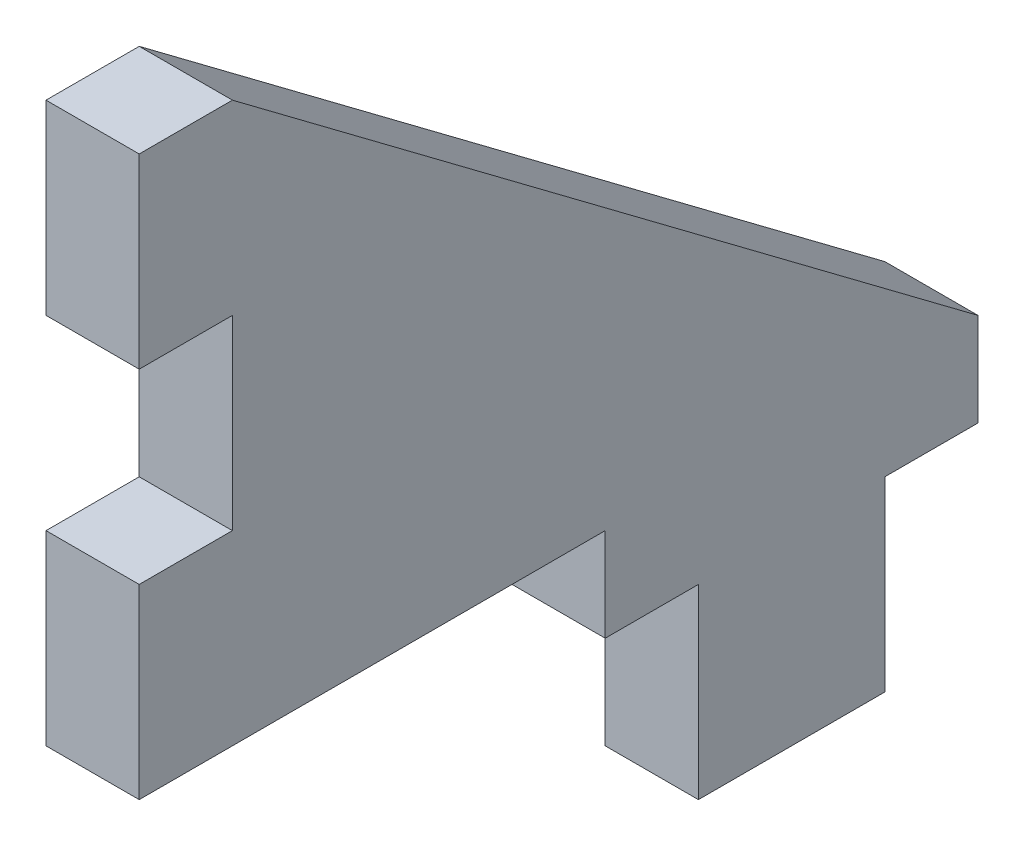
ISO-10303-21;
HEADER;
FILE_DESCRIPTION(('STEP AP214'),'2;1');
FILE_NAME('part.step','',(''),(''),'','','');
FILE_SCHEMA(('AUTOMOTIVE_DESIGN { 1 0 10303 214 1 1 1 1 }'));
ENDSEC;
DATA;
#1=APPLICATION_CONTEXT('core data for automotive mechanical design processes');
#2=APPLICATION_PROTOCOL_DEFINITION('international standard','automotive_design',2000,#1);
#3=PRODUCT_CONTEXT('',#1,'mechanical');
#4=PRODUCT('Part','Part','',(#3));
#5=PRODUCT_RELATED_PRODUCT_CATEGORY('part','',(#4));
#6=PRODUCT_DEFINITION_FORMATION('','',#4);
#7=PRODUCT_DEFINITION_CONTEXT('part definition',#1,'design');
#8=PRODUCT_DEFINITION('design','',#6,#7);
#9=PRODUCT_DEFINITION_SHAPE('','',#8);
#10=(LENGTH_UNIT() NAMED_UNIT(*) SI_UNIT(.MILLI.,.METRE.));
#11=(NAMED_UNIT(*) PLANE_ANGLE_UNIT() SI_UNIT($,.RADIAN.));
#12=(NAMED_UNIT(*) SI_UNIT($,.STERADIAN.) SOLID_ANGLE_UNIT());
#13=UNCERTAINTY_MEASURE_WITH_UNIT(LENGTH_MEASURE(1.E-05),#10,'distance_accuracy_value','');
#14=(GEOMETRIC_REPRESENTATION_CONTEXT(3) GLOBAL_UNCERTAINTY_ASSIGNED_CONTEXT((#13)) GLOBAL_UNIT_ASSIGNED_CONTEXT((#10,
#11,#12)) REPRESENTATION_CONTEXT('',''));
#15=CARTESIAN_POINT('',(0.,0.,0.));
#16=DIRECTION('',(0.,0.,1.));
#17=DIRECTION('',(1.,0.,0.));
#18=AXIS2_PLACEMENT_3D('',#15,#16,#17);
#19=CARTESIAN_POINT('',(2.5,11.25,11.25));
#20=DIRECTION('',(0.,1.,0.));
#21=DIRECTION('',(0.,0.,1.));
#22=AXIS2_PLACEMENT_3D('',#19,#20,#21);
#23=PLANE('',#22);
#24=DIRECTION('',(0.,0.,-1.));
#25=VECTOR('',#24,1.);
#26=CARTESIAN_POINT('',(0.,11.25,11.25));
#27=LINE('',#26,#25);
#28=CARTESIAN_POINT('',(0.,11.25,11.25));
#29=VERTEX_POINT('',#28);
#30=CARTESIAN_POINT('',(0.,11.25,8.75));
#31=VERTEX_POINT('',#30);
#32=EDGE_CURVE('E184',#29,#31,#27,.T.);
#33=ORIENTED_EDGE('',*,*,#32,.F.);
#34=DIRECTION('',(-1.,0.,0.));
#35=VECTOR('',#34,1.);
#36=CARTESIAN_POINT('',(2.5,11.25,11.25));
#37=LINE('',#36,#35);
#38=CARTESIAN_POINT('',(2.5,11.25,11.25));
#39=VERTEX_POINT('',#38);
#40=EDGE_CURVE('E11',#39,#29,#37,.T.);
#41=ORIENTED_EDGE('',*,*,#40,.F.);
#42=DIRECTION('',(0.,0.,-1.));
#43=VECTOR('',#42,1.);
#44=CARTESIAN_POINT('',(2.5,11.25,11.25));
#45=LINE('',#44,#43);
#46=CARTESIAN_POINT('',(2.5,11.25,8.75));
#47=VERTEX_POINT('',#46);
#48=EDGE_CURVE('E238',#39,#47,#45,.T.);
#49=ORIENTED_EDGE('',*,*,#48,.T.);
#50=DIRECTION('',(-1.,0.,0.));
#51=VECTOR('',#50,1.);
#52=CARTESIAN_POINT('',(2.5,11.25,8.75));
#53=LINE('',#52,#51);
#54=EDGE_CURVE('E42',#47,#31,#53,.T.);
#55=ORIENTED_EDGE('',*,*,#54,.T.);
#56=EDGE_LOOP('',(#33,#41,#49,#55));
#57=FACE_BOUND('',#56,.T.);
#58=ADVANCED_FACE('F39',(#57),#23,.T.);
#59=CARTESIAN_POINT('',(2.5,6.25,11.25));
#60=DIRECTION('',(0.,0.,1.));
#61=DIRECTION('',(0.,-1.,0.));
#62=AXIS2_PLACEMENT_3D('',#59,#60,#61);
#63=PLANE('',#62);
#64=DIRECTION('',(0.,1.,0.));
#65=VECTOR('',#64,1.);
#66=CARTESIAN_POINT('',(0.,6.25,11.25));
#67=LINE('',#66,#65);
#68=CARTESIAN_POINT('',(0.,6.25,11.25));
#69=VERTEX_POINT('',#68);
#70=EDGE_CURVE('E235',#69,#29,#67,.T.);
#71=ORIENTED_EDGE('',*,*,#70,.F.);
#72=DIRECTION('',(-1.,0.,0.));
#73=VECTOR('',#72,1.);
#74=CARTESIAN_POINT('',(2.5,6.25,11.25));
#75=LINE('',#74,#73);
#76=CARTESIAN_POINT('',(2.5,6.25,11.25));
#77=VERTEX_POINT('',#76);
#78=EDGE_CURVE('E49',#77,#69,#75,.T.);
#79=ORIENTED_EDGE('',*,*,#78,.F.);
#80=DIRECTION('',(0.,1.,0.));
#81=VECTOR('',#80,1.);
#82=CARTESIAN_POINT('',(2.5,6.25,11.25));
#83=LINE('',#82,#81);
#84=EDGE_CURVE('E170',#77,#39,#83,.T.);
#85=ORIENTED_EDGE('',*,*,#84,.T.);
#86=ORIENTED_EDGE('',*,*,#40,.T.);
#87=EDGE_LOOP('',(#71,#79,#85,#86));
#88=FACE_BOUND('',#87,.T.);
#89=ADVANCED_FACE('F279',(#88),#63,.T.);
#90=CARTESIAN_POINT('',(2.5,6.25,8.75000000000001));
#91=DIRECTION('',(0.,-1.,0.));
#92=DIRECTION('',(0.,0.,-1.));
#93=AXIS2_PLACEMENT_3D('',#90,#91,#92);
#94=PLANE('',#93);
#95=DIRECTION('',(0.,0.,1.));
#96=VECTOR('',#95,1.);
#97=CARTESIAN_POINT('',(0.,6.25,8.75000000000001));
#98=LINE('',#97,#96);
#99=CARTESIAN_POINT('',(0.,6.25,8.75000000000001));
#100=VERTEX_POINT('',#99);
#101=EDGE_CURVE('E156',#100,#69,#98,.T.);
#102=ORIENTED_EDGE('',*,*,#101,.F.);
#103=DIRECTION('',(-1.,0.,0.));
#104=VECTOR('',#103,1.);
#105=CARTESIAN_POINT('',(2.5,6.25,8.75000000000001));
#106=LINE('',#105,#104);
#107=CARTESIAN_POINT('',(2.5,6.25,8.75000000000001));
#108=VERTEX_POINT('',#107);
#109=EDGE_CURVE('E151',#108,#100,#106,.T.);
#110=ORIENTED_EDGE('',*,*,#109,.F.);
#111=DIRECTION('',(0.,0.,1.));
#112=VECTOR('',#111,1.);
#113=CARTESIAN_POINT('',(2.5,6.25,8.75000000000001));
#114=LINE('',#113,#112);
#115=EDGE_CURVE('E154',#108,#77,#114,.T.);
#116=ORIENTED_EDGE('',*,*,#115,.T.);
#117=ORIENTED_EDGE('',*,*,#78,.T.);
#118=EDGE_LOOP('',(#102,#110,#116,#117));
#119=FACE_BOUND('',#118,.T.);
#120=ADVANCED_FACE('F153',(#119),#94,.T.);
#121=CARTESIAN_POINT('',(2.5,1.25,8.75000000000001));
#122=DIRECTION('',(0.,0.,1.));
#123=DIRECTION('',(1.,0.,0.));
#124=AXIS2_PLACEMENT_3D('',#121,#122,#123);
#125=PLANE('',#124);
#126=DIRECTION('',(0.,1.,0.));
#127=VECTOR('',#126,1.);
#128=CARTESIAN_POINT('',(0.,1.25,8.75000000000001));
#129=LINE('',#128,#127);
#130=CARTESIAN_POINT('',(0.,1.25,8.75000000000001));
#131=VERTEX_POINT('',#130);
#132=EDGE_CURVE('E230',#131,#100,#129,.T.);
#133=ORIENTED_EDGE('',*,*,#132,.F.);
#134=DIRECTION('',(-1.,0.,0.));
#135=VECTOR('',#134,1.);
#136=CARTESIAN_POINT('',(2.5,1.25,8.75000000000001));
#137=LINE('',#136,#135);
#138=CARTESIAN_POINT('',(2.5,1.25,8.75000000000001));
#139=VERTEX_POINT('',#138);
#140=EDGE_CURVE('E162',#139,#131,#137,.T.);
#141=ORIENTED_EDGE('',*,*,#140,.F.);
#142=DIRECTION('',(0.,1.,0.));
#143=VECTOR('',#142,1.);
#144=CARTESIAN_POINT('',(2.5,1.25,8.75000000000001));
#145=LINE('',#144,#143);
#146=EDGE_CURVE('E168',#139,#108,#145,.T.);
#147=ORIENTED_EDGE('',*,*,#146,.T.);
#148=ORIENTED_EDGE('',*,*,#109,.T.);
#149=EDGE_LOOP('',(#133,#141,#147,#148));
#150=FACE_BOUND('',#149,.T.);
#151=ADVANCED_FACE('F173',(#150),#125,.T.);
#152=CARTESIAN_POINT('',(2.5,1.25,11.25));
#153=DIRECTION('',(0.,1.,0.));
#154=DIRECTION('',(0.,0.,1.));
#155=AXIS2_PLACEMENT_3D('',#152,#153,#154);
#156=PLANE('',#155);
#157=DIRECTION('',(0.,0.,-1.));
#158=VECTOR('',#157,1.);
#159=CARTESIAN_POINT('',(0.,1.25,11.25));
#160=LINE('',#159,#158);
#161=CARTESIAN_POINT('',(0.,1.25,11.25));
#162=VERTEX_POINT('',#161);
#163=EDGE_CURVE('E226',#162,#131,#160,.T.);
#164=ORIENTED_EDGE('',*,*,#163,.F.);
#165=DIRECTION('',(-1.,0.,0.));
#166=VECTOR('',#165,1.);
#167=CARTESIAN_POINT('',(2.5,1.25,11.25));
#168=LINE('',#167,#166);
#169=CARTESIAN_POINT('',(2.5,1.25,11.25));
#170=VERTEX_POINT('',#169);
#171=EDGE_CURVE('E244',#170,#162,#168,.T.);
#172=ORIENTED_EDGE('',*,*,#171,.F.);
#173=DIRECTION('',(0.,0.,-1.));
#174=VECTOR('',#173,1.);
#175=CARTESIAN_POINT('',(2.5,1.25,11.25));
#176=LINE('',#175,#174);
#177=EDGE_CURVE('E175',#170,#139,#176,.T.);
#178=ORIENTED_EDGE('',*,*,#177,.T.);
#179=ORIENTED_EDGE('',*,*,#140,.T.);
#180=EDGE_LOOP('',(#164,#172,#178,#179));
#181=FACE_BOUND('',#180,.T.);
#182=ADVANCED_FACE('F292',(#181),#156,.T.);
#183=CARTESIAN_POINT('',(2.5,-3.75,11.25));
#184=DIRECTION('',(0.,0.,1.));
#185=DIRECTION('',(0.,-1.,0.));
#186=AXIS2_PLACEMENT_3D('',#183,#184,#185);
#187=PLANE('',#186);
#188=DIRECTION('',(0.,1.,0.));
#189=VECTOR('',#188,1.);
#190=CARTESIAN_POINT('',(0.,-3.75,11.25));
#191=LINE('',#190,#189);
#192=CARTESIAN_POINT('',(0.,-3.75,11.25));
#193=VERTEX_POINT('',#192);
#194=EDGE_CURVE('E222',#193,#162,#191,.T.);
#195=ORIENTED_EDGE('',*,*,#194,.F.);
#196=DIRECTION('',(-1.,0.,0.));
#197=VECTOR('',#196,1.);
#198=CARTESIAN_POINT('',(2.5,-3.75,11.25));
#199=LINE('',#198,#197);
#200=CARTESIAN_POINT('',(2.5,-3.75,11.25));
#201=VERTEX_POINT('',#200);
#202=EDGE_CURVE('E247',#201,#193,#199,.T.);
#203=ORIENTED_EDGE('',*,*,#202,.F.);
#204=DIRECTION('',(0.,1.,0.));
#205=VECTOR('',#204,1.);
#206=CARTESIAN_POINT('',(2.5,-3.75,11.25));
#207=LINE('',#206,#205);
#208=EDGE_CURVE('E178',#201,#170,#207,.T.);
#209=ORIENTED_EDGE('',*,*,#208,.T.);
#210=ORIENTED_EDGE('',*,*,#171,.T.);
#211=EDGE_LOOP('',(#195,#203,#209,#210));
#212=FACE_BOUND('',#211,.T.);
#213=ADVANCED_FACE('F295',(#212),#187,.T.);
#214=CARTESIAN_POINT('',(2.5,-3.75,11.25));
#215=DIRECTION('',(0.,1.,0.));
#216=DIRECTION('',(0.,0.,1.));
#217=AXIS2_PLACEMENT_3D('',#214,#215,#216);
#218=PLANE('',#217);
#219=DIRECTION('',(0.,0.,-1.));
#220=VECTOR('',#219,1.);
#221=CARTESIAN_POINT('',(0.,-3.75,11.25));
#222=LINE('',#221,#220);
#223=CARTESIAN_POINT('',(0.,-3.75,-1.25));
#224=VERTEX_POINT('',#223);
#225=EDGE_CURVE('E219',#193,#224,#222,.T.);
#226=ORIENTED_EDGE('',*,*,#225,.T.);
#227=DIRECTION('',(-1.,0.,0.));
#228=VECTOR('',#227,1.);
#229=CARTESIAN_POINT('',(2.5,-3.75,-1.25));
#230=LINE('',#229,#228);
#231=CARTESIAN_POINT('',(2.5,-3.75,-1.25));
#232=VERTEX_POINT('',#231);
#233=EDGE_CURVE('E250',#232,#224,#230,.T.);
#234=ORIENTED_EDGE('',*,*,#233,.F.);
#235=DIRECTION('',(0.,0.,-1.));
#236=VECTOR('',#235,1.);
#237=CARTESIAN_POINT('',(2.5,-3.75,11.25));
#238=LINE('',#237,#236);
#239=EDGE_CURVE('E466',#201,#232,#238,.T.);
#240=ORIENTED_EDGE('',*,*,#239,.F.);
#241=ORIENTED_EDGE('',*,*,#202,.T.);
#242=EDGE_LOOP('',(#226,#234,#240,#241));
#243=FACE_BOUND('',#242,.T.);
#244=ADVANCED_FACE('F299',(#243),#218,.F.);
#245=CARTESIAN_POINT('',(2.5,-3.75,-1.25));
#246=DIRECTION('',(0.,0.,-1.));
#247=DIRECTION('',(0.,1.,0.));
#248=AXIS2_PLACEMENT_3D('',#245,#246,#247);
#249=PLANE('',#248);
#250=DIRECTION('',(0.,-1.,0.));
#251=VECTOR('',#250,1.);
#252=CARTESIAN_POINT('',(0.,-3.75,-1.25));
#253=LINE('',#252,#251);
#254=CARTESIAN_POINT('',(0.,-6.25,-1.25));
#255=VERTEX_POINT('',#254);
#256=EDGE_CURVE('E216',#224,#255,#253,.T.);
#257=ORIENTED_EDGE('',*,*,#256,.T.);
#258=DIRECTION('',(-1.,0.,0.));
#259=VECTOR('',#258,1.);
#260=CARTESIAN_POINT('',(2.5,-6.25,-1.25));
#261=LINE('',#260,#259);
#262=CARTESIAN_POINT('',(2.5,-6.25,-1.25));
#263=VERTEX_POINT('',#262);
#264=EDGE_CURVE('E254',#263,#255,#261,.T.);
#265=ORIENTED_EDGE('',*,*,#264,.F.);
#266=DIRECTION('',(0.,-1.,0.));
#267=VECTOR('',#266,1.);
#268=CARTESIAN_POINT('',(2.5,-3.75,-1.25));
#269=LINE('',#268,#267);
#270=EDGE_CURVE('E458',#232,#263,#269,.T.);
#271=ORIENTED_EDGE('',*,*,#270,.F.);
#272=ORIENTED_EDGE('',*,*,#233,.T.);
#273=EDGE_LOOP('',(#257,#265,#271,#272));
#274=FACE_BOUND('',#273,.T.);
#275=ADVANCED_FACE('F303',(#274),#249,.F.);
#276=CARTESIAN_POINT('',(2.5,-6.25,-1.25));
#277=DIRECTION('',(0.,1.,0.));
#278=DIRECTION('',(0.,0.,1.));
#279=AXIS2_PLACEMENT_3D('',#276,#277,#278);
#280=PLANE('',#279);
#281=DIRECTION('',(0.,0.,-1.));
#282=VECTOR('',#281,1.);
#283=CARTESIAN_POINT('',(0.,-6.25,-1.25));
#284=LINE('',#283,#282);
#285=CARTESIAN_POINT('',(0.,-6.25,-3.75));
#286=VERTEX_POINT('',#285);
#287=EDGE_CURVE('E212',#255,#286,#284,.T.);
#288=ORIENTED_EDGE('',*,*,#287,.T.);
#289=DIRECTION('',(-1.,0.,0.));
#290=VECTOR('',#289,1.);
#291=CARTESIAN_POINT('',(2.5,-6.25,-3.75));
#292=LINE('',#291,#290);
#293=CARTESIAN_POINT('',(2.5,-6.25,-3.75));
#294=VERTEX_POINT('',#293);
#295=EDGE_CURVE('E258',#294,#286,#292,.T.);
#296=ORIENTED_EDGE('',*,*,#295,.F.);
#297=DIRECTION('',(0.,0.,-1.));
#298=VECTOR('',#297,1.);
#299=CARTESIAN_POINT('',(2.5,-6.25,-1.25));
#300=LINE('',#299,#298);
#301=EDGE_CURVE('E456',#263,#294,#300,.T.);
#302=ORIENTED_EDGE('',*,*,#301,.F.);
#303=ORIENTED_EDGE('',*,*,#264,.T.);
#304=EDGE_LOOP('',(#288,#296,#302,#303));
#305=FACE_BOUND('',#304,.T.);
#306=ADVANCED_FACE('F307',(#305),#280,.F.);
#307=CARTESIAN_POINT('',(2.5,-11.25,-3.75));
#308=DIRECTION('',(0.,0.,1.));
#309=DIRECTION('',(1.,0.,0.));
#310=AXIS2_PLACEMENT_3D('',#307,#308,#309);
#311=PLANE('',#310);
#312=DIRECTION('',(0.,1.,0.));
#313=VECTOR('',#312,1.);
#314=CARTESIAN_POINT('',(0.,-11.25,-3.75));
#315=LINE('',#314,#313);
#316=CARTESIAN_POINT('',(0.,-11.25,-3.75));
#317=VERTEX_POINT('',#316);
#318=EDGE_CURVE('E208',#317,#286,#315,.T.);
#319=ORIENTED_EDGE('',*,*,#318,.F.);
#320=DIRECTION('',(-1.,0.,0.));
#321=VECTOR('',#320,1.);
#322=CARTESIAN_POINT('',(2.5,-11.25,-3.75));
#323=LINE('',#322,#321);
#324=CARTESIAN_POINT('',(2.5,-11.25,-3.75));
#325=VERTEX_POINT('',#324);
#326=EDGE_CURVE('E261',#325,#317,#323,.T.);
#327=ORIENTED_EDGE('',*,*,#326,.F.);
#328=DIRECTION('',(0.,1.,0.));
#329=VECTOR('',#328,1.);
#330=CARTESIAN_POINT('',(2.5,-11.25,-3.75));
#331=LINE('',#330,#329);
#332=EDGE_CURVE('E453',#325,#294,#331,.T.);
#333=ORIENTED_EDGE('',*,*,#332,.T.);
#334=ORIENTED_EDGE('',*,*,#295,.T.);
#335=EDGE_LOOP('',(#319,#327,#333,#334));
#336=FACE_BOUND('',#335,.T.);
#337=ADVANCED_FACE('F311',(#336),#311,.T.);
#338=CARTESIAN_POINT('',(2.5,-11.25,-8.75));
#339=DIRECTION('',(0.,-1.,0.));
#340=DIRECTION('',(0.,0.,-1.));
#341=AXIS2_PLACEMENT_3D('',#338,#339,#340);
#342=PLANE('',#341);
#343=DIRECTION('',(0.,0.,1.));
#344=VECTOR('',#343,1.);
#345=CARTESIAN_POINT('',(0.,-11.25,-8.75));
#346=LINE('',#345,#344);
#347=CARTESIAN_POINT('',(0.,-11.25,-8.75));
#348=VERTEX_POINT('',#347);
#349=EDGE_CURVE('E204',#348,#317,#346,.T.);
#350=ORIENTED_EDGE('',*,*,#349,.F.);
#351=DIRECTION('',(-1.,0.,0.));
#352=VECTOR('',#351,1.);
#353=CARTESIAN_POINT('',(2.5,-11.25,-8.75));
#354=LINE('',#353,#352);
#355=CARTESIAN_POINT('',(2.5,-11.25,-8.75));
#356=VERTEX_POINT('',#355);
#357=EDGE_CURVE('E264',#356,#348,#354,.T.);
#358=ORIENTED_EDGE('',*,*,#357,.F.);
#359=DIRECTION('',(0.,0.,1.));
#360=VECTOR('',#359,1.);
#361=CARTESIAN_POINT('',(2.5,-11.25,-8.75));
#362=LINE('',#361,#360);
#363=EDGE_CURVE('E477',#356,#325,#362,.T.);
#364=ORIENTED_EDGE('',*,*,#363,.T.);
#365=ORIENTED_EDGE('',*,*,#326,.T.);
#366=EDGE_LOOP('',(#350,#358,#364,#365));
#367=FACE_BOUND('',#366,.T.);
#368=ADVANCED_FACE('F315',(#367),#342,.T.);
#369=CARTESIAN_POINT('',(2.5,-6.25,-8.75));
#370=DIRECTION('',(0.,0.,-1.));
#371=DIRECTION('',(0.,1.,0.));
#372=AXIS2_PLACEMENT_3D('',#369,#370,#371);
#373=PLANE('',#372);
#374=DIRECTION('',(0.,-1.,0.));
#375=VECTOR('',#374,1.);
#376=CARTESIAN_POINT('',(0.,-6.25,-8.75));
#377=LINE('',#376,#375);
#378=CARTESIAN_POINT('',(0.,-6.25,-8.75));
#379=VERTEX_POINT('',#378);
#380=EDGE_CURVE('E200',#379,#348,#377,.T.);
#381=ORIENTED_EDGE('',*,*,#380,.F.);
#382=DIRECTION('',(-1.,0.,0.));
#383=VECTOR('',#382,1.);
#384=CARTESIAN_POINT('',(2.5,-6.25,-8.75));
#385=LINE('',#384,#383);
#386=CARTESIAN_POINT('',(2.5,-6.25,-8.75));
#387=VERTEX_POINT('',#386);
#388=EDGE_CURVE('E267',#387,#379,#385,.T.);
#389=ORIENTED_EDGE('',*,*,#388,.F.);
#390=DIRECTION('',(0.,-1.,0.));
#391=VECTOR('',#390,1.);
#392=CARTESIAN_POINT('',(2.5,-6.25,-8.75));
#393=LINE('',#392,#391);
#394=EDGE_CURVE('E444',#387,#356,#393,.T.);
#395=ORIENTED_EDGE('',*,*,#394,.T.);
#396=ORIENTED_EDGE('',*,*,#357,.T.);
#397=EDGE_LOOP('',(#381,#389,#395,#396));
#398=FACE_BOUND('',#397,.T.);
#399=ADVANCED_FACE('F319',(#398),#373,.T.);
#400=CARTESIAN_POINT('',(2.5,-6.25,-11.25));
#401=DIRECTION('',(0.,-1.,0.));
#402=DIRECTION('',(0.,0.,-1.));
#403=AXIS2_PLACEMENT_3D('',#400,#401,#402);
#404=PLANE('',#403);
#405=DIRECTION('',(0.,0.,1.));
#406=VECTOR('',#405,1.);
#407=CARTESIAN_POINT('',(0.,-6.25,-11.25));
#408=LINE('',#407,#406);
#409=CARTESIAN_POINT('',(0.,-6.25,-11.25));
#410=VERTEX_POINT('',#409);
#411=EDGE_CURVE('E196',#410,#379,#408,.T.);
#412=ORIENTED_EDGE('',*,*,#411,.F.);
#413=DIRECTION('',(-1.,0.,0.));
#414=VECTOR('',#413,1.);
#415=CARTESIAN_POINT('',(2.5,-6.25,-11.25));
#416=LINE('',#415,#414);
#417=CARTESIAN_POINT('',(2.5,-6.25,-11.25));
#418=VERTEX_POINT('',#417);
#419=EDGE_CURVE('E270',#418,#410,#416,.T.);
#420=ORIENTED_EDGE('',*,*,#419,.F.);
#421=DIRECTION('',(0.,0.,1.));
#422=VECTOR('',#421,1.);
#423=CARTESIAN_POINT('',(2.5,-6.25,-11.25));
#424=LINE('',#423,#422);
#425=EDGE_CURVE('E440',#418,#387,#424,.T.);
#426=ORIENTED_EDGE('',*,*,#425,.T.);
#427=ORIENTED_EDGE('',*,*,#388,.T.);
#428=EDGE_LOOP('',(#412,#420,#426,#427));
#429=FACE_BOUND('',#428,.T.);
#430=ADVANCED_FACE('F323',(#429),#404,.T.);
#431=CARTESIAN_POINT('',(2.5,-3.75,-11.25));
#432=DIRECTION('',(0.,0.,-1.));
#433=DIRECTION('',(-1.,0.,0.));
#434=AXIS2_PLACEMENT_3D('',#431,#432,#433);
#435=PLANE('',#434);
#436=DIRECTION('',(0.,-1.,0.));
#437=VECTOR('',#436,1.);
#438=CARTESIAN_POINT('',(0.,-3.75,-11.25));
#439=LINE('',#438,#437);
#440=CARTESIAN_POINT('',(0.,-3.75,-11.25));
#441=VERTEX_POINT('',#440);
#442=EDGE_CURVE('E192',#441,#410,#439,.T.);
#443=ORIENTED_EDGE('',*,*,#442,.F.);
#444=DIRECTION('',(-1.,0.,0.));
#445=VECTOR('',#444,1.);
#446=CARTESIAN_POINT('',(2.5,-3.75,-11.25));
#447=LINE('',#446,#445);
#448=CARTESIAN_POINT('',(2.5,-3.75,-11.25));
#449=VERTEX_POINT('',#448);
#450=EDGE_CURVE('E272',#449,#441,#447,.T.);
#451=ORIENTED_EDGE('',*,*,#450,.F.);
#452=DIRECTION('',(0.,-1.,0.));
#453=VECTOR('',#452,1.);
#454=CARTESIAN_POINT('',(2.5,-3.75,-11.25));
#455=LINE('',#454,#453);
#456=EDGE_CURVE('E484',#449,#418,#455,.T.);
#457=ORIENTED_EDGE('',*,*,#456,.T.);
#458=ORIENTED_EDGE('',*,*,#419,.T.);
#459=EDGE_LOOP('',(#443,#451,#457,#458));
#460=FACE_BOUND('',#459,.T.);
#461=ADVANCED_FACE('F327',(#460),#435,.T.);
#462=CARTESIAN_POINT('',(2.5,11.25,8.75));
#463=DIRECTION('',(0.,0.8,-0.6));
#464=DIRECTION('',(0.,0.6,0.8));
#465=AXIS2_PLACEMENT_3D('',#462,#463,#464);
#466=PLANE('',#465);
#467=DIRECTION('',(0.,-0.6,-0.8));
#468=VECTOR('',#467,1.);
#469=CARTESIAN_POINT('',(0.,11.25,8.75));
#470=LINE('',#469,#468);
#471=EDGE_CURVE('E188',#31,#441,#470,.T.);
#472=ORIENTED_EDGE('',*,*,#471,.F.);
#473=ORIENTED_EDGE('',*,*,#54,.F.);
#474=DIRECTION('',(0.,-0.6,-0.8));
#475=VECTOR('',#474,1.);
#476=CARTESIAN_POINT('',(2.5,11.25,8.75));
#477=LINE('',#476,#475);
#478=EDGE_CURVE('E487',#47,#449,#477,.T.);
#479=ORIENTED_EDGE('',*,*,#478,.T.);
#480=ORIENTED_EDGE('',*,*,#450,.T.);
#481=EDGE_LOOP('',(#472,#473,#479,#480));
#482=FACE_BOUND('',#481,.T.);
#483=ADVANCED_FACE('F276',(#482),#466,.T.);
#484=CARTESIAN_POINT('',(2.5,0.,0.));
#485=DIRECTION('',(-1.,0.,0.));
#486=DIRECTION('',(0.,0.,1.));
#487=AXIS2_PLACEMENT_3D('',#484,#485,#486);
#488=PLANE('',#487);
#489=ORIENTED_EDGE('',*,*,#48,.F.);
#490=ORIENTED_EDGE('',*,*,#84,.F.);
#491=ORIENTED_EDGE('',*,*,#115,.F.);
#492=ORIENTED_EDGE('',*,*,#146,.F.);
#493=ORIENTED_EDGE('',*,*,#177,.F.);
#494=ORIENTED_EDGE('',*,*,#208,.F.);
#495=ORIENTED_EDGE('',*,*,#239,.T.);
#496=ORIENTED_EDGE('',*,*,#270,.T.);
#497=ORIENTED_EDGE('',*,*,#301,.T.);
#498=ORIENTED_EDGE('',*,*,#332,.F.);
#499=ORIENTED_EDGE('',*,*,#363,.F.);
#500=ORIENTED_EDGE('',*,*,#394,.F.);
#501=ORIENTED_EDGE('',*,*,#425,.F.);
#502=ORIENTED_EDGE('',*,*,#456,.F.);
#503=ORIENTED_EDGE('',*,*,#478,.F.);
#504=EDGE_LOOP('',(#489,#490,#491,#492,#493,#494,#495,#496,#497,#498,#499,#500,#501,#502,#503));
#505=FACE_BOUND('',#504,.T.);
#506=ADVANCED_FACE('F166',(#505),#488,.F.);
#507=CARTESIAN_POINT('',(0.,0.,0.));
#508=DIRECTION('',(-1.,0.,0.));
#509=DIRECTION('',(0.,0.,1.));
#510=AXIS2_PLACEMENT_3D('',#507,#508,#509);
#511=PLANE('',#510);
#512=ORIENTED_EDGE('',*,*,#32,.T.);
#513=ORIENTED_EDGE('',*,*,#471,.T.);
#514=ORIENTED_EDGE('',*,*,#442,.T.);
#515=ORIENTED_EDGE('',*,*,#411,.T.);
#516=ORIENTED_EDGE('',*,*,#380,.T.);
#517=ORIENTED_EDGE('',*,*,#349,.T.);
#518=ORIENTED_EDGE('',*,*,#318,.T.);
#519=ORIENTED_EDGE('',*,*,#287,.F.);
#520=ORIENTED_EDGE('',*,*,#256,.F.);
#521=ORIENTED_EDGE('',*,*,#225,.F.);
#522=ORIENTED_EDGE('',*,*,#194,.T.);
#523=ORIENTED_EDGE('',*,*,#163,.T.);
#524=ORIENTED_EDGE('',*,*,#132,.T.);
#525=ORIENTED_EDGE('',*,*,#101,.T.);
#526=ORIENTED_EDGE('',*,*,#70,.T.);
#527=EDGE_LOOP('',(#512,#513,#514,#515,#516,#517,#518,#519,#520,#521,#522,#523,#524,#525,#526));
#528=FACE_BOUND('',#527,.T.);
#529=ADVANCED_FACE('F278',(#528),#511,.T.);
#530=CLOSED_SHELL('',(#58,#89,#120,#151,#182,#213,#244,#275,#306,#337,#368,#399,#430,#461,#483,
#506,#529));
#531=MANIFOLD_SOLID_BREP('B2',#530);
#532=ADVANCED_BREP_SHAPE_REPRESENTATION('',(#18,#531),#14);
#533=SHAPE_DEFINITION_REPRESENTATION(#9,#532);
ENDSEC;
END-ISO-10303-21;
